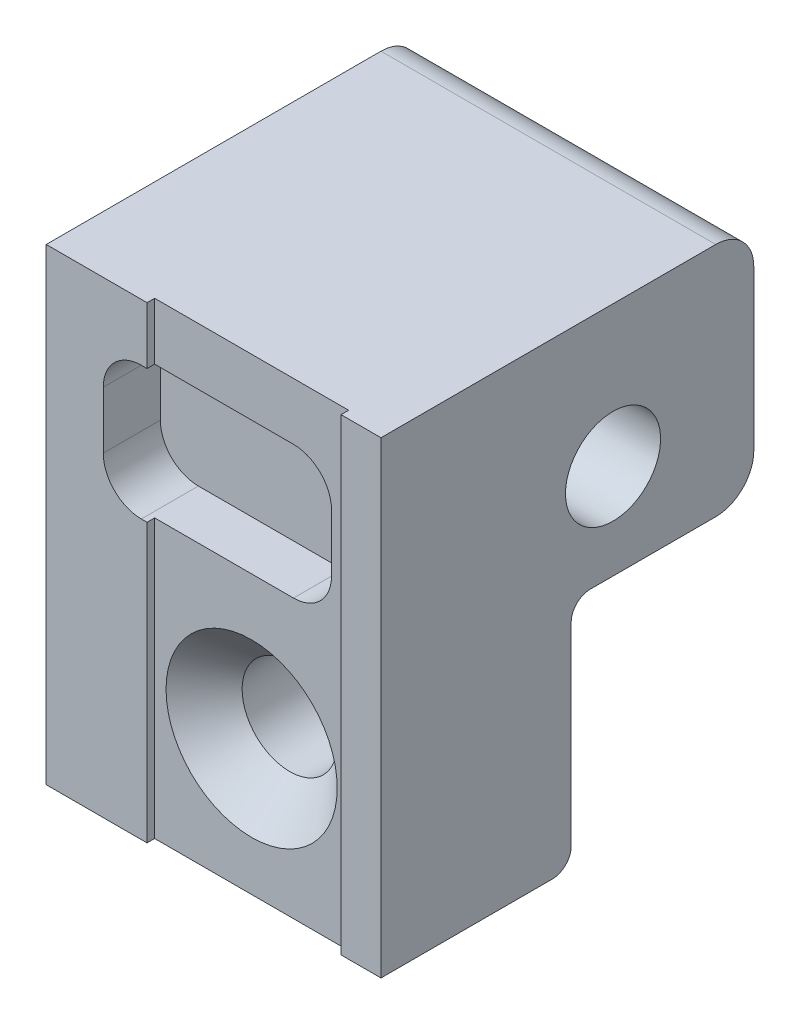
ISO-10303-21;
HEADER;
FILE_DESCRIPTION(('STEP AP214'),'2;1');
FILE_NAME('part.step','',(''),(''),'','','');
FILE_SCHEMA(('AUTOMOTIVE_DESIGN { 1 0 10303 214 1 1 1 1 }'));
ENDSEC;
DATA;
#1=APPLICATION_CONTEXT('core data for automotive mechanical design processes');
#2=APPLICATION_PROTOCOL_DEFINITION('international standard','automotive_design',2000,#1);
#3=PRODUCT_CONTEXT('',#1,'mechanical');
#4=PRODUCT('Part','Part','',(#3));
#5=PRODUCT_RELATED_PRODUCT_CATEGORY('part','',(#4));
#6=PRODUCT_DEFINITION_FORMATION('','',#4);
#7=PRODUCT_DEFINITION_CONTEXT('part definition',#1,'design');
#8=PRODUCT_DEFINITION('design','',#6,#7);
#9=PRODUCT_DEFINITION_SHAPE('','',#8);
#10=(LENGTH_UNIT() NAMED_UNIT(*) SI_UNIT(.MILLI.,.METRE.));
#11=(NAMED_UNIT(*) PLANE_ANGLE_UNIT() SI_UNIT($,.RADIAN.));
#12=(NAMED_UNIT(*) SI_UNIT($,.STERADIAN.) SOLID_ANGLE_UNIT());
#13=UNCERTAINTY_MEASURE_WITH_UNIT(LENGTH_MEASURE(1.E-05),#10,'distance_accuracy_value','');
#14=(GEOMETRIC_REPRESENTATION_CONTEXT(3) GLOBAL_UNCERTAINTY_ASSIGNED_CONTEXT((#13)) GLOBAL_UNIT_ASSIGNED_CONTEXT((#10,
#11,#12)) REPRESENTATION_CONTEXT('',''));
#15=CARTESIAN_POINT('',(0.,0.,0.));
#16=DIRECTION('',(0.,0.,1.));
#17=DIRECTION('',(1.,0.,0.));
#18=AXIS2_PLACEMENT_3D('',#15,#16,#17);
#19=CARTESIAN_POINT('',(1.37999999999991,15.4500000000005,-1.5));
#20=DIRECTION('',(0.,0.,1.));
#21=DIRECTION('',(1.,0.,0.));
#22=AXIS2_PLACEMENT_3D('',#19,#20,#21);
#23=PLANE('',#22);
#24=DIRECTION('',(0.,1.,0.));
#25=VECTOR('',#24,1.);
#26=CARTESIAN_POINT('',(1.37999999999991,15.4500000000005,-1.5));
#27=LINE('',#26,#25);
#28=CARTESIAN_POINT('',(1.37999999999991,17.9500000000005,-1.5));
#29=VERTEX_POINT('',#28);
#30=CARTESIAN_POINT('',(1.37999999999991,16.4500000000005,-1.5));
#31=VERTEX_POINT('',#30);
#32=EDGE_CURVE('E245',#29,#31,#27,.F.);
#33=ORIENTED_EDGE('',*,*,#32,.T.);
#34=CARTESIAN_POINT('',(2.37999999999991,16.4500000000005,-1.5));
#35=DIRECTION('',(0.,0.,1.));
#36=DIRECTION('',(1.,0.,0.));
#37=AXIS2_PLACEMENT_3D('',#34,#35,#36);
#38=CIRCLE('',#37,1.);
#39=CARTESIAN_POINT('',(2.37999999999991,15.4500000000005,-1.5));
#40=VERTEX_POINT('',#39);
#41=EDGE_CURVE('E189',#31,#40,#38,.T.);
#42=ORIENTED_EDGE('',*,*,#41,.T.);
#43=DIRECTION('',(1.,0.,0.));
#44=VECTOR('',#43,1.);
#45=CARTESIAN_POINT('',(1.37999999999991,15.4500000000005,-1.5));
#46=LINE('',#45,#44);
#47=CARTESIAN_POINT('',(6.17999999999991,15.4500000000005,-1.5));
#48=VERTEX_POINT('',#47);
#49=EDGE_CURVE('E187',#40,#48,#46,.T.);
#50=ORIENTED_EDGE('',*,*,#49,.T.);
#51=CARTESIAN_POINT('',(6.17999999999991,16.4500000000005,-1.5));
#52=DIRECTION('',(0.,0.,1.));
#53=DIRECTION('',(1.,0.,0.));
#54=AXIS2_PLACEMENT_3D('',#51,#52,#53);
#55=CIRCLE('',#54,1.);
#56=CARTESIAN_POINT('',(7.17999999999991,16.4500000000005,-1.5));
#57=VERTEX_POINT('',#56);
#58=EDGE_CURVE('E20',#48,#57,#55,.T.);
#59=ORIENTED_EDGE('',*,*,#58,.T.);
#60=DIRECTION('',(0.,1.,0.));
#61=VECTOR('',#60,1.);
#62=CARTESIAN_POINT('',(7.17999999999991,15.4500000000005,-1.5));
#63=LINE('',#62,#61);
#64=CARTESIAN_POINT('',(7.17999999999991,17.9500000000005,-1.5));
#65=VERTEX_POINT('',#64);
#66=EDGE_CURVE('E185',#57,#65,#63,.T.);
#67=ORIENTED_EDGE('',*,*,#66,.T.);
#68=CARTESIAN_POINT('',(6.17999999999991,17.9500000000005,-1.5));
#69=DIRECTION('',(0.,0.,1.));
#70=DIRECTION('',(1.,0.,0.));
#71=AXIS2_PLACEMENT_3D('',#68,#69,#70);
#72=CIRCLE('',#71,1.);
#73=CARTESIAN_POINT('',(6.17999999999991,18.9500000000005,-1.5));
#74=VERTEX_POINT('',#73);
#75=EDGE_CURVE('E230',#65,#74,#72,.T.);
#76=ORIENTED_EDGE('',*,*,#75,.T.);
#77=DIRECTION('',(1.,0.,0.));
#78=VECTOR('',#77,1.);
#79=CARTESIAN_POINT('',(1.37999999999991,18.9500000000005,-1.5));
#80=LINE('',#79,#78);
#81=CARTESIAN_POINT('',(2.37999999999991,18.9500000000005,-1.5));
#82=VERTEX_POINT('',#81);
#83=EDGE_CURVE('E222',#74,#82,#80,.F.);
#84=ORIENTED_EDGE('',*,*,#83,.T.);
#85=CARTESIAN_POINT('',(2.37999999999991,17.9500000000005,-1.5));
#86=DIRECTION('',(0.,0.,1.));
#87=DIRECTION('',(1.,0.,0.));
#88=AXIS2_PLACEMENT_3D('',#85,#86,#87);
#89=CIRCLE('',#88,1.);
#90=EDGE_CURVE('E247',#82,#29,#89,.T.);
#91=ORIENTED_EDGE('',*,*,#90,.T.);
#92=EDGE_LOOP('',(#33,#42,#50,#59,#67,#76,#84,#91));
#93=FACE_BOUND('',#92,.T.);
#94=ADVANCED_FACE('F17',(#93),#23,.T.);
#95=CARTESIAN_POINT('',(6.17999999999991,17.9500000000005,-1.5));
#96=DIRECTION('',(0.,0.,1.));
#97=DIRECTION('',(1.,0.,0.));
#98=AXIS2_PLACEMENT_3D('',#95,#96,#97);
#99=CYLINDRICAL_SURFACE('',#98,1.);
#100=DIRECTION('',(0.,0.,-1.));
#101=VECTOR('',#100,1.);
#102=CARTESIAN_POINT('',(7.17999999999991,17.9500000000005,-1.5));
#103=LINE('',#102,#101);
#104=CARTESIAN_POINT('',(7.17999999999991,17.9500000000005,-0.200000000000402));
#105=VERTEX_POINT('',#104);
#106=EDGE_CURVE('E198',#65,#105,#103,.F.);
#107=ORIENTED_EDGE('',*,*,#106,.T.);
#108=CARTESIAN_POINT('',(6.17999999999991,17.9500000000005,-0.200000000000297));
#109=DIRECTION('',(0.,0.,1.));
#110=DIRECTION('',(1.,0.,0.));
#111=AXIS2_PLACEMENT_3D('',#108,#109,#110);
#112=CIRCLE('',#111,1.);
#113=CARTESIAN_POINT('',(6.17999999999991,18.9500000000005,-0.2000000000003));
#114=VERTEX_POINT('',#113);
#115=EDGE_CURVE('E283',#105,#114,#112,.T.);
#116=ORIENTED_EDGE('',*,*,#115,.T.);
#117=DIRECTION('',(0.,0.,1.));
#118=VECTOR('',#117,1.);
#119=CARTESIAN_POINT('',(6.17999999999991,18.9500000000005,-1.5));
#120=LINE('',#119,#118);
#121=EDGE_CURVE('E219',#114,#74,#120,.F.);
#122=ORIENTED_EDGE('',*,*,#121,.T.);
#123=ORIENTED_EDGE('',*,*,#75,.F.);
#124=EDGE_LOOP('',(#107,#116,#122,#123));
#125=FACE_BOUND('',#124,.T.);
#126=ADVANCED_FACE('F488',(#125),#99,.F.);
#127=CARTESIAN_POINT('',(1.37999999999991,18.9500000000005,-1.5));
#128=DIRECTION('',(0.,1.,0.));
#129=DIRECTION('',(0.,0.,1.));
#130=AXIS2_PLACEMENT_3D('',#127,#128,#129);
#131=PLANE('',#130);
#132=ORIENTED_EDGE('',*,*,#121,.F.);
#133=DIRECTION('',(1.,0.,0.));
#134=VECTOR('',#133,1.);
#135=CARTESIAN_POINT('',(2.5299999999999,18.9500000000005,-0.200000000000304));
#136=LINE('',#135,#134);
#137=CARTESIAN_POINT('',(2.5299999999999,18.9500000000005,-0.200000000000304));
#138=VERTEX_POINT('',#137);
#139=EDGE_CURVE('E285',#114,#138,#136,.F.);
#140=ORIENTED_EDGE('',*,*,#139,.T.);
#141=DIRECTION('',(0.,0.,1.));
#142=VECTOR('',#141,1.);
#143=CARTESIAN_POINT('',(2.5299999999999,18.9500000000005,-2.5058080610485E-12));
#144=LINE('',#143,#142);
#145=CARTESIAN_POINT('',(2.5299999999999,18.9500000000005,0.));
#146=VERTEX_POINT('',#145);
#147=EDGE_CURVE('E212',#138,#146,#144,.T.);
#148=ORIENTED_EDGE('',*,*,#147,.T.);
#149=DIRECTION('',(1.,0.,0.));
#150=VECTOR('',#149,1.);
#151=CARTESIAN_POINT('',(1.37999999999991,18.9500000000005,0.));
#152=LINE('',#151,#150);
#153=CARTESIAN_POINT('',(2.37999999999991,18.9500000000005,0.));
#154=VERTEX_POINT('',#153);
#155=EDGE_CURVE('E223',#154,#146,#152,.T.);
#156=ORIENTED_EDGE('',*,*,#155,.F.);
#157=DIRECTION('',(0.,0.,1.));
#158=VECTOR('',#157,1.);
#159=CARTESIAN_POINT('',(2.37999999999991,18.9500000000005,-1.5));
#160=LINE('',#159,#158);
#161=EDGE_CURVE('E290',#154,#82,#160,.F.);
#162=ORIENTED_EDGE('',*,*,#161,.T.);
#163=ORIENTED_EDGE('',*,*,#83,.F.);
#164=EDGE_LOOP('',(#132,#140,#148,#156,#162,#163));
#165=FACE_BOUND('',#164,.T.);
#166=ADVANCED_FACE('F485',(#165),#131,.F.);
#167=CARTESIAN_POINT('',(1.37999999999991,15.4500000000005,-1.5));
#168=DIRECTION('',(0.,-1.,0.));
#169=DIRECTION('',(0.,0.,-1.));
#170=AXIS2_PLACEMENT_3D('',#167,#168,#169);
#171=PLANE('',#170);
#172=DIRECTION('',(0.,0.,1.));
#173=VECTOR('',#172,1.);
#174=CARTESIAN_POINT('',(6.17999999999991,15.4500000000005,-1.5));
#175=LINE('',#174,#173);
#176=CARTESIAN_POINT('',(6.17999999999991,15.4500000000005,-0.200000000000912));
#177=VERTEX_POINT('',#176);
#178=EDGE_CURVE('E180',#177,#48,#175,.F.);
#179=ORIENTED_EDGE('',*,*,#178,.T.);
#180=ORIENTED_EDGE('',*,*,#49,.F.);
#181=DIRECTION('',(0.,0.,1.));
#182=VECTOR('',#181,1.);
#183=CARTESIAN_POINT('',(2.37999999999991,15.4500000000005,-1.5));
#184=LINE('',#183,#182);
#185=CARTESIAN_POINT('',(2.37999999999991,15.4500000000005,-5.05671893247239E-13));
#186=VERTEX_POINT('',#185);
#187=EDGE_CURVE('E307',#40,#186,#184,.T.);
#188=ORIENTED_EDGE('',*,*,#187,.T.);
#189=DIRECTION('',(1.,0.,0.));
#190=VECTOR('',#189,1.);
#191=CARTESIAN_POINT('',(1.37999999999991,15.4500000000005,-1.01568059518442E-12));
#192=LINE('',#191,#190);
#193=CARTESIAN_POINT('',(2.5299999999999,15.4500000000005,-3.35668992601512E-13));
#194=VERTEX_POINT('',#193);
#195=EDGE_CURVE('E193',#194,#186,#192,.F.);
#196=ORIENTED_EDGE('',*,*,#195,.F.);
#197=DIRECTION('',(0.,0.,1.));
#198=VECTOR('',#197,1.);
#199=CARTESIAN_POINT('',(2.5299999999999,15.4500000000005,-2.5058080610485E-12));
#200=LINE('',#199,#198);
#201=CARTESIAN_POINT('',(2.5299999999999,15.4500000000005,-0.200000000001017));
#202=VERTEX_POINT('',#201);
#203=EDGE_CURVE('E211',#194,#202,#200,.F.);
#204=ORIENTED_EDGE('',*,*,#203,.T.);
#205=DIRECTION('',(1.,0.,0.));
#206=VECTOR('',#205,1.);
#207=CARTESIAN_POINT('',(2.5299999999999,15.4500000000005,-0.200000000001018));
#208=LINE('',#207,#206);
#209=EDGE_CURVE('E197',#202,#177,#208,.T.);
#210=ORIENTED_EDGE('',*,*,#209,.T.);
#211=EDGE_LOOP('',(#179,#180,#188,#196,#204,#210));
#212=FACE_BOUND('',#211,.T.);
#213=ADVANCED_FACE('F195',(#212),#171,.F.);
#214=CARTESIAN_POINT('',(6.17999999999991,16.4500000000005,-1.5));
#215=DIRECTION('',(0.,0.,1.));
#216=DIRECTION('',(1.,0.,0.));
#217=AXIS2_PLACEMENT_3D('',#214,#215,#216);
#218=CYLINDRICAL_SURFACE('',#217,1.);
#219=ORIENTED_EDGE('',*,*,#178,.F.);
#220=CARTESIAN_POINT('',(6.17999999999991,16.4500000000005,-0.200000000000807));
#221=DIRECTION('',(0.,0.,1.));
#222=DIRECTION('',(1.,0.,0.));
#223=AXIS2_PLACEMENT_3D('',#220,#221,#222);
#224=CIRCLE('',#223,1.);
#225=CARTESIAN_POINT('',(7.17999999999991,16.4500000000005,-0.20000000000081));
#226=VERTEX_POINT('',#225);
#227=EDGE_CURVE('E281',#177,#226,#224,.T.);
#228=ORIENTED_EDGE('',*,*,#227,.T.);
#229=DIRECTION('',(0.,0.,-1.));
#230=VECTOR('',#229,1.);
#231=CARTESIAN_POINT('',(7.17999999999991,16.4500000000005,-1.5));
#232=LINE('',#231,#230);
#233=EDGE_CURVE('E183',#226,#57,#232,.T.);
#234=ORIENTED_EDGE('',*,*,#233,.T.);
#235=ORIENTED_EDGE('',*,*,#58,.F.);
#236=EDGE_LOOP('',(#219,#228,#234,#235));
#237=FACE_BOUND('',#236,.T.);
#238=ADVANCED_FACE('F178',(#237),#218,.F.);
#239=CARTESIAN_POINT('',(7.17999999999991,18.9500000000005,-1.5));
#240=DIRECTION('',(1.,0.,0.));
#241=DIRECTION('',(0.,0.,-1.));
#242=AXIS2_PLACEMENT_3D('',#239,#240,#241);
#243=PLANE('',#242);
#244=ORIENTED_EDGE('',*,*,#233,.F.);
#245=DIRECTION('',(0.,1.,2.0391851472707E-13));
#246=VECTOR('',#245,1.);
#247=CARTESIAN_POINT('',(7.17999999999991,8.14999999999855,-0.200000000002507));
#248=LINE('',#247,#246);
#249=EDGE_CURVE('E280',#226,#105,#248,.T.);
#250=ORIENTED_EDGE('',*,*,#249,.T.);
#251=ORIENTED_EDGE('',*,*,#106,.F.);
#252=ORIENTED_EDGE('',*,*,#66,.F.);
#253=EDGE_LOOP('',(#244,#250,#251,#252));
#254=FACE_BOUND('',#253,.T.);
#255=ADVANCED_FACE('F493',(#254),#243,.F.);
#256=CARTESIAN_POINT('',(5.07999999999991,11.7,-0.200000000120326));
#257=DIRECTION('',(0.,0.,1.));
#258=DIRECTION('',(0.,-1.,0.));
#259=AXIS2_PLACEMENT_3D('',#256,#257,#258);
#260=CONICAL_SURFACE('',#259,2.24999999991089,0.785398163369027);
#261=CARTESIAN_POINT('',(5.07999999999991,11.7,-1.20000000000179));
#262=DIRECTION('',(0.,0.,1.));
#263=DIRECTION('',(1.,0.,0.));
#264=AXIS2_PLACEMENT_3D('',#261,#262,#263);
#265=CIRCLE('',#264,1.25000000000009);
#266=CARTESIAN_POINT('',(6.33,11.7,-1.20000000000179));
#267=VERTEX_POINT('',#266);
#268=EDGE_CURVE('E224',#267,#267,#265,.F.);
#269=ORIENTED_EDGE('',*,*,#268,.T.);
#270=EDGE_LOOP('',(#269));
#271=FACE_BOUND('',#270,.T.);
#272=CARTESIAN_POINT('',(5.07999999999991,11.7,-0.200000000063483));
#273=DIRECTION('',(0.,0.,1.));
#274=DIRECTION('',(0.,-1.,0.));
#275=AXIS2_PLACEMENT_3D('',#272,#273,#274);
#276=CIRCLE('',#275,2.24999999996773);
#277=CARTESIAN_POINT('',(5.07999999999991,9.45000000003227,-0.200000000063483));
#278=VERTEX_POINT('',#277);
#279=EDGE_CURVE('E277',#278,#278,#276,.T.);
#280=ORIENTED_EDGE('',*,*,#279,.T.);
#281=EDGE_LOOP('',(#280));
#282=FACE_BOUND('',#281,.T.);
#283=ADVANCED_FACE('F495',(#271,#282),#260,.F.);
#284=CARTESIAN_POINT('',(2.5299999999999,8.1499999999985,-2.5058080610485E-12));
#285=DIRECTION('',(-1.,0.,0.));
#286=DIRECTION('',(0.,0.,1.));
#287=AXIS2_PLACEMENT_3D('',#284,#285,#286);
#288=PLANE('',#287);
#289=DIRECTION('',(0.,0.,1.));
#290=VECTOR('',#289,1.);
#291=CARTESIAN_POINT('',(2.5299999999999,20.4500000000005,-2.5058080610485E-12));
#292=LINE('',#291,#290);
#293=CARTESIAN_POINT('',(2.5299999999999,20.4500000000005,0.));
#294=VERTEX_POINT('',#293);
#295=CARTESIAN_POINT('',(2.5299999999999,20.4500000000005,-0.199999999999997));
#296=VERTEX_POINT('',#295);
#297=EDGE_CURVE('E209',#294,#296,#292,.F.);
#298=ORIENTED_EDGE('',*,*,#297,.F.);
#299=DIRECTION('',(0.,1.,0.));
#300=VECTOR('',#299,1.);
#301=CARTESIAN_POINT('',(2.5299999999999,20.4500000000005,0.));
#302=LINE('',#301,#300);
#303=EDGE_CURVE('E238',#146,#294,#302,.T.);
#304=ORIENTED_EDGE('',*,*,#303,.F.);
#305=ORIENTED_EDGE('',*,*,#147,.F.);
#306=DIRECTION('',(0.,1.,2.0391851472707E-13));
#307=VECTOR('',#306,1.);
#308=CARTESIAN_POINT('',(2.5299999999999,8.14999999999855,-0.200000000002507));
#309=LINE('',#308,#307);
#310=EDGE_CURVE('E206',#138,#296,#309,.T.);
#311=ORIENTED_EDGE('',*,*,#310,.T.);
#312=EDGE_LOOP('',(#298,#304,#305,#311));
#313=FACE_BOUND('',#312,.T.);
#314=ADVANCED_FACE('F480',(#313),#288,.F.);
#315=CARTESIAN_POINT('',(2.5299999999999,8.1499999999985,-2.5058080610485E-12));
#316=DIRECTION('',(-1.,0.,0.));
#317=DIRECTION('',(0.,0.,1.));
#318=AXIS2_PLACEMENT_3D('',#315,#316,#317);
#319=PLANE('',#318);
#320=DIRECTION('',(0.,0.,1.));
#321=VECTOR('',#320,1.);
#322=CARTESIAN_POINT('',(2.5299999999999,8.14999999999855,-2.5058080610485E-12));
#323=LINE('',#322,#321);
#324=CARTESIAN_POINT('',(2.5299999999999,8.14999999999953,-0.20000000000201));
#325=VERTEX_POINT('',#324);
#326=CARTESIAN_POINT('',(2.5299999999999,8.14999999999985,-1.66909310446902E-12));
#327=VERTEX_POINT('',#326);
#328=EDGE_CURVE('E314',#325,#327,#323,.T.);
#329=ORIENTED_EDGE('',*,*,#328,.F.);
#330=DIRECTION('',(0.,1.,2.0391851472707E-13));
#331=VECTOR('',#330,1.);
#332=CARTESIAN_POINT('',(2.5299999999999,8.14999999999855,-0.200000000002507));
#333=LINE('',#332,#331);
#334=EDGE_CURVE('E203',#325,#202,#333,.T.);
#335=ORIENTED_EDGE('',*,*,#334,.T.);
#336=ORIENTED_EDGE('',*,*,#203,.F.);
#337=DIRECTION('',(0.,1.,0.));
#338=VECTOR('',#337,1.);
#339=CARTESIAN_POINT('',(2.5299999999999,20.4500000000005,0.));
#340=LINE('',#339,#338);
#341=EDGE_CURVE('E241',#327,#194,#340,.T.);
#342=ORIENTED_EDGE('',*,*,#341,.F.);
#343=EDGE_LOOP('',(#329,#335,#336,#342));
#344=FACE_BOUND('',#343,.T.);
#345=ADVANCED_FACE('F325',(#344),#319,.F.);
#346=CARTESIAN_POINT('',(2.37999999999991,16.4500000000005,-1.5));
#347=DIRECTION('',(0.,0.,1.));
#348=DIRECTION('',(1.,0.,0.));
#349=AXIS2_PLACEMENT_3D('',#346,#347,#348);
#350=CYLINDRICAL_SURFACE('',#349,1.);
#351=DIRECTION('',(0.,0.,1.));
#352=VECTOR('',#351,1.);
#353=CARTESIAN_POINT('',(1.37999999999991,16.4500000000005,-1.5));
#354=LINE('',#353,#352);
#355=CARTESIAN_POINT('',(1.37999999999991,16.4500000000005,0.));
#356=VERTEX_POINT('',#355);
#357=EDGE_CURVE('E304',#31,#356,#354,.T.);
#358=ORIENTED_EDGE('',*,*,#357,.T.);
#359=CARTESIAN_POINT('',(2.37999999999991,16.4500000000005,0.));
#360=DIRECTION('',(0.,0.,1.));
#361=DIRECTION('',(1.,0.,0.));
#362=AXIS2_PLACEMENT_3D('',#359,#360,#361);
#363=CIRCLE('',#362,1.);
#364=EDGE_CURVE('E273',#186,#356,#363,.F.);
#365=ORIENTED_EDGE('',*,*,#364,.F.);
#366=ORIENTED_EDGE('',*,*,#187,.F.);
#367=ORIENTED_EDGE('',*,*,#41,.F.);
#368=EDGE_LOOP('',(#358,#365,#366,#367));
#369=FACE_BOUND('',#368,.T.);
#370=ADVANCED_FACE('F568',(#369),#350,.F.);
#371=CARTESIAN_POINT('',(1.37999999999991,18.9500000000005,-1.5));
#372=DIRECTION('',(-1.,0.,0.));
#373=DIRECTION('',(0.,0.,1.));
#374=AXIS2_PLACEMENT_3D('',#371,#372,#373);
#375=PLANE('',#374);
#376=DIRECTION('',(0.,0.,1.));
#377=VECTOR('',#376,1.);
#378=CARTESIAN_POINT('',(1.37999999999991,17.9500000000005,-1.5));
#379=LINE('',#378,#377);
#380=CARTESIAN_POINT('',(1.37999999999991,17.9500000000005,0.));
#381=VERTEX_POINT('',#380);
#382=EDGE_CURVE('E300',#29,#381,#379,.T.);
#383=ORIENTED_EDGE('',*,*,#382,.T.);
#384=DIRECTION('',(0.,1.,0.));
#385=VECTOR('',#384,1.);
#386=CARTESIAN_POINT('',(1.37999999999991,20.4500000000005,0.));
#387=LINE('',#386,#385);
#388=EDGE_CURVE('E272',#356,#381,#387,.T.);
#389=ORIENTED_EDGE('',*,*,#388,.F.);
#390=ORIENTED_EDGE('',*,*,#357,.F.);
#391=ORIENTED_EDGE('',*,*,#32,.F.);
#392=EDGE_LOOP('',(#383,#389,#390,#391));
#393=FACE_BOUND('',#392,.T.);
#394=ADVANCED_FACE('F565',(#393),#375,.F.);
#395=CARTESIAN_POINT('',(2.37999999999991,17.9500000000005,-1.5));
#396=DIRECTION('',(0.,0.,1.));
#397=DIRECTION('',(1.,0.,0.));
#398=AXIS2_PLACEMENT_3D('',#395,#396,#397);
#399=CYLINDRICAL_SURFACE('',#398,1.);
#400=ORIENTED_EDGE('',*,*,#161,.F.);
#401=CARTESIAN_POINT('',(2.37999999999991,17.9500000000005,0.));
#402=DIRECTION('',(0.,0.,1.));
#403=DIRECTION('',(1.,0.,0.));
#404=AXIS2_PLACEMENT_3D('',#401,#402,#403);
#405=CIRCLE('',#404,1.);
#406=EDGE_CURVE('E269',#381,#154,#405,.F.);
#407=ORIENTED_EDGE('',*,*,#406,.F.);
#408=ORIENTED_EDGE('',*,*,#382,.F.);
#409=ORIENTED_EDGE('',*,*,#90,.F.);
#410=EDGE_LOOP('',(#400,#407,#408,#409));
#411=FACE_BOUND('',#410,.T.);
#412=ADVANCED_FACE('F298',(#411),#399,.F.);
#413=CARTESIAN_POINT('',(-0.12000000000009,8.6500000000005,-4.4999998882413));
#414=DIRECTION('',(-1.,0.,0.));
#415=DIRECTION('',(0.,0.,1.));
#416=AXIS2_PLACEMENT_3D('',#413,#414,#415);
#417=CYLINDRICAL_SURFACE('',#416,0.5);
#418=CARTESIAN_POINT('',(8.68,8.6500000000005,-4.4999998882413));
#419=DIRECTION('',(-1.,0.,0.));
#420=DIRECTION('',(0.,0.,1.));
#421=AXIS2_PLACEMENT_3D('',#418,#419,#420);
#422=CIRCLE('',#421,0.5);
#423=CARTESIAN_POINT('',(8.68,8.6500000000005,-4.9999998882413));
#424=VERTEX_POINT('',#423);
#425=CARTESIAN_POINT('',(8.68,8.1500000000005,-4.4999998882413));
#426=VERTEX_POINT('',#425);
#427=EDGE_CURVE('E228',#424,#426,#422,.T.);
#428=ORIENTED_EDGE('',*,*,#427,.T.);
#429=DIRECTION('',(1.,0.,0.));
#430=VECTOR('',#429,1.);
#431=CARTESIAN_POINT('',(-0.12000000000009,8.1500000000005,-4.4999998882413));
#432=LINE('',#431,#430);
#433=CARTESIAN_POINT('',(-0.12000000000009,8.1500000000005,-4.4999998882413));
#434=VERTEX_POINT('',#433);
#435=EDGE_CURVE('E365',#434,#426,#432,.T.);
#436=ORIENTED_EDGE('',*,*,#435,.F.);
#437=CARTESIAN_POINT('',(-0.12000000000009,8.6500000000005,-4.4999998882413));
#438=DIRECTION('',(-1.,0.,0.));
#439=DIRECTION('',(0.,0.,1.));
#440=AXIS2_PLACEMENT_3D('',#437,#438,#439);
#441=CIRCLE('',#440,0.5);
#442=CARTESIAN_POINT('',(-0.12000000000009,8.6500000000005,-4.9999998882413));
#443=VERTEX_POINT('',#442);
#444=EDGE_CURVE('E266',#443,#434,#441,.T.);
#445=ORIENTED_EDGE('',*,*,#444,.F.);
#446=DIRECTION('',(-1.,0.,0.));
#447=VECTOR('',#446,1.);
#448=CARTESIAN_POINT('',(-0.12000000000009,8.6500000000005,-4.9999998882413));
#449=LINE('',#448,#447);
#450=EDGE_CURVE('E356',#424,#443,#449,.T.);
#451=ORIENTED_EDGE('',*,*,#450,.F.);
#452=EDGE_LOOP('',(#428,#436,#445,#451));
#453=FACE_BOUND('',#452,.T.);
#454=ADVANCED_FACE('F558',(#453),#417,.T.);
#455=CARTESIAN_POINT('',(5.07999999999991,11.7,0.));
#456=DIRECTION('',(0.,0.,1.));
#457=DIRECTION('',(1.,0.,0.));
#458=AXIS2_PLACEMENT_3D('',#455,#456,#457);
#459=CYLINDRICAL_SURFACE('',#458,1.25000000000009);
#460=CARTESIAN_POINT('',(5.07999999999991,11.7,-4.9999998882413));
#461=DIRECTION('',(0.,0.,1.));
#462=DIRECTION('',(1.,0.,0.));
#463=AXIS2_PLACEMENT_3D('',#460,#461,#462);
#464=CIRCLE('',#463,1.25000000000009);
#465=CARTESIAN_POINT('',(6.33,11.7,-4.9999998882413));
#466=VERTEX_POINT('',#465);
#467=EDGE_CURVE('E253',#466,#466,#464,.T.);
#468=ORIENTED_EDGE('',*,*,#467,.F.);
#469=EDGE_LOOP('',(#468));
#470=FACE_BOUND('',#469,.T.);
#471=ORIENTED_EDGE('',*,*,#268,.F.);
#472=EDGE_LOOP('',(#471));
#473=FACE_BOUND('',#472,.T.);
#474=ADVANCED_FACE('F554',(#470,#473),#459,.F.);
#475=CARTESIAN_POINT('',(-0.12000000000009,13.7500000000025,-5.4999998882413));
#476=DIRECTION('',(-1.,0.,0.));
#477=DIRECTION('',(0.,0.,1.));
#478=AXIS2_PLACEMENT_3D('',#475,#476,#477);
#479=CYLINDRICAL_SURFACE('',#478,0.5);
#480=DIRECTION('',(-1.,0.,0.));
#481=VECTOR('',#480,1.);
#482=CARTESIAN_POINT('',(-0.12000000000009,13.7500000000025,-4.9999998882413));
#483=LINE('',#482,#481);
#484=CARTESIAN_POINT('',(-0.12000000000009,13.7500000000025,-4.9999998882413));
#485=VERTEX_POINT('',#484);
#486=CARTESIAN_POINT('',(8.68,13.7500000000025,-4.9999998882413));
#487=VERTEX_POINT('',#486);
#488=EDGE_CURVE('E257',#485,#487,#483,.F.);
#489=ORIENTED_EDGE('',*,*,#488,.F.);
#490=CARTESIAN_POINT('',(-0.12000000000009,13.7500000000025,-5.4999998882413));
#491=DIRECTION('',(-1.,0.,0.));
#492=DIRECTION('',(0.,0.,1.));
#493=AXIS2_PLACEMENT_3D('',#490,#491,#492);
#494=CIRCLE('',#493,0.5);
#495=CARTESIAN_POINT('',(-0.12000000000009,14.2500000000025,-5.4999998882413));
#496=VERTEX_POINT('',#495);
#497=EDGE_CURVE('E258',#496,#485,#494,.F.);
#498=ORIENTED_EDGE('',*,*,#497,.F.);
#499=DIRECTION('',(1.,0.,0.));
#500=VECTOR('',#499,1.);
#501=CARTESIAN_POINT('',(-0.12000000000009,14.2500000000025,-5.4999998882413));
#502=LINE('',#501,#500);
#503=CARTESIAN_POINT('',(8.68,14.2500000000025,-5.4999998882413));
#504=VERTEX_POINT('',#503);
#505=EDGE_CURVE('E256',#504,#496,#502,.F.);
#506=ORIENTED_EDGE('',*,*,#505,.F.);
#507=CARTESIAN_POINT('',(8.68,13.7500000000025,-5.4999998882413));
#508=DIRECTION('',(-1.,0.,0.));
#509=DIRECTION('',(0.,0.,1.));
#510=AXIS2_PLACEMENT_3D('',#507,#508,#509);
#511=CIRCLE('',#510,0.5);
#512=EDGE_CURVE('E227',#487,#504,#511,.T.);
#513=ORIENTED_EDGE('',*,*,#512,.F.);
#514=EDGE_LOOP('',(#489,#498,#506,#513));
#515=FACE_BOUND('',#514,.T.);
#516=ADVANCED_FACE('F550',(#515),#479,.F.);
#517=CARTESIAN_POINT('',(-0.12000000000009,15.2500000000025,-8.8));
#518=DIRECTION('',(-1.,0.,0.));
#519=DIRECTION('',(0.,0.,1.));
#520=AXIS2_PLACEMENT_3D('',#517,#518,#519);
#521=CYLINDRICAL_SURFACE('',#520,0.999999999999999);
#522=CARTESIAN_POINT('',(8.68,15.2500000000025,-8.8));
#523=DIRECTION('',(-1.,0.,0.));
#524=DIRECTION('',(0.,0.,1.));
#525=AXIS2_PLACEMENT_3D('',#522,#523,#524);
#526=CIRCLE('',#525,0.999999999999999);
#527=CARTESIAN_POINT('',(8.68,15.2500000000025,-9.8));
#528=VERTEX_POINT('',#527);
#529=CARTESIAN_POINT('',(8.68,14.2500000000025,-8.8));
#530=VERTEX_POINT('',#529);
#531=EDGE_CURVE('E286',#528,#530,#526,.T.);
#532=ORIENTED_EDGE('',*,*,#531,.T.);
#533=DIRECTION('',(1.,0.,0.));
#534=VECTOR('',#533,1.);
#535=CARTESIAN_POINT('',(-0.12000000000009,14.2500000000025,-8.8));
#536=LINE('',#535,#534);
#537=CARTESIAN_POINT('',(-0.12000000000009,14.2500000000025,-8.8));
#538=VERTEX_POINT('',#537);
#539=EDGE_CURVE('E352',#538,#530,#536,.T.);
#540=ORIENTED_EDGE('',*,*,#539,.F.);
#541=CARTESIAN_POINT('',(-0.12000000000009,15.2500000000025,-8.8));
#542=DIRECTION('',(-1.,0.,0.));
#543=DIRECTION('',(0.,0.,1.));
#544=AXIS2_PLACEMENT_3D('',#541,#542,#543);
#545=CIRCLE('',#544,0.999999999999999);
#546=CARTESIAN_POINT('',(-0.12000000000009,15.2500000000025,-9.79999999999999));
#547=VERTEX_POINT('',#546);
#548=EDGE_CURVE('E261',#547,#538,#545,.T.);
#549=ORIENTED_EDGE('',*,*,#548,.F.);
#550=DIRECTION('',(1.,0.,0.));
#551=VECTOR('',#550,1.);
#552=CARTESIAN_POINT('',(-0.12000000000009,15.2500000000025,-9.79999999999999));
#553=LINE('',#552,#551);
#554=EDGE_CURVE('E348',#528,#547,#553,.F.);
#555=ORIENTED_EDGE('',*,*,#554,.F.);
#556=EDGE_LOOP('',(#532,#540,#549,#555));
#557=FACE_BOUND('',#556,.T.);
#558=ADVANCED_FACE('F546',(#557),#521,.T.);
#559=CARTESIAN_POINT('',(2.5299999999999,8.14999999999855,-0.200000000002507));
#560=DIRECTION('',(0.,2.0391851472707E-13,-1.));
#561=DIRECTION('',(0.,1.,2.0391851472707E-13));
#562=AXIS2_PLACEMENT_3D('',#559,#560,#561);
#563=PLANE('',#562);
#564=ORIENTED_EDGE('',*,*,#279,.F.);
#565=EDGE_LOOP('',(#564));
#566=FACE_BOUND('',#565,.T.);
#567=ORIENTED_EDGE('',*,*,#227,.F.);
#568=ORIENTED_EDGE('',*,*,#209,.F.);
#569=ORIENTED_EDGE('',*,*,#334,.F.);
#570=DIRECTION('',(1.,0.,0.));
#571=VECTOR('',#570,1.);
#572=CARTESIAN_POINT('',(-0.12000000000009,8.1500000000005,-0.200000000002507));
#573=LINE('',#572,#571);
#574=CARTESIAN_POINT('',(7.62999999999991,8.14999999999983,-0.200000000002507));
#575=VERTEX_POINT('',#574);
#576=EDGE_CURVE('E357',#575,#325,#573,.F.);
#577=ORIENTED_EDGE('',*,*,#576,.F.);
#578=DIRECTION('',(0.,1.,0.));
#579=VECTOR('',#578,1.);
#580=CARTESIAN_POINT('',(7.62999999999991,8.1499999999985,-0.200000000002507));
#581=LINE('',#580,#579);
#582=CARTESIAN_POINT('',(7.62999999999991,20.4500000000005,-0.200000000000832));
#583=VERTEX_POINT('',#582);
#584=EDGE_CURVE('E268',#575,#583,#581,.T.);
#585=ORIENTED_EDGE('',*,*,#584,.T.);
#586=DIRECTION('',(1.,0.,0.));
#587=VECTOR('',#586,1.);
#588=CARTESIAN_POINT('',(-0.12000000000009,20.4500000000005,-0.199999999999995));
#589=LINE('',#588,#587);
#590=EDGE_CURVE('E385',#296,#583,#589,.T.);
#591=ORIENTED_EDGE('',*,*,#590,.F.);
#592=ORIENTED_EDGE('',*,*,#310,.F.);
#593=ORIENTED_EDGE('',*,*,#139,.F.);
#594=ORIENTED_EDGE('',*,*,#115,.F.);
#595=ORIENTED_EDGE('',*,*,#249,.F.);
#596=EDGE_LOOP('',(#567,#568,#569,#577,#585,#591,#592,#593,#594,#595));
#597=FACE_BOUND('',#596,.T.);
#598=ADVANCED_FACE('F329',(#566,#597),#563,.F.);
#599=CARTESIAN_POINT('',(-0.12000000000009,19.4500000000023,-8.8));
#600=DIRECTION('',(-1.,0.,0.));
#601=DIRECTION('',(0.,0.,1.));
#602=AXIS2_PLACEMENT_3D('',#599,#600,#601);
#603=CYLINDRICAL_SURFACE('',#602,0.999999999999999);
#604=CARTESIAN_POINT('',(8.68,19.4500000000023,-8.8));
#605=DIRECTION('',(-1.,0.,0.));
#606=DIRECTION('',(0.,0.,1.));
#607=AXIS2_PLACEMENT_3D('',#604,#605,#606);
#608=CIRCLE('',#607,0.999999999999999);
#609=CARTESIAN_POINT('',(8.68,20.4500000000023,-8.79999999999989));
#610=VERTEX_POINT('',#609);
#611=CARTESIAN_POINT('',(8.68,19.4500000000023,-9.79999999999999));
#612=VERTEX_POINT('',#611);
#613=EDGE_CURVE('E242',#610,#612,#608,.T.);
#614=ORIENTED_EDGE('',*,*,#613,.T.);
#615=DIRECTION('',(1.,0.,0.));
#616=VECTOR('',#615,1.);
#617=CARTESIAN_POINT('',(-0.12000000000009,19.4500000000023,-9.79999999999998));
#618=LINE('',#617,#616);
#619=CARTESIAN_POINT('',(-0.12000000000009,19.4500000000023,-9.79999999999998));
#620=VERTEX_POINT('',#619);
#621=EDGE_CURVE('E347',#620,#612,#618,.T.);
#622=ORIENTED_EDGE('',*,*,#621,.F.);
#623=CARTESIAN_POINT('',(-0.12000000000009,19.4500000000023,-8.8));
#624=DIRECTION('',(-1.,0.,0.));
#625=DIRECTION('',(0.,0.,1.));
#626=AXIS2_PLACEMENT_3D('',#623,#624,#625);
#627=CIRCLE('',#626,0.999999999999999);
#628=CARTESIAN_POINT('',(-0.12000000000009,20.4500000000023,-8.79999999999979));
#629=VERTEX_POINT('',#628);
#630=EDGE_CURVE('E263',#629,#620,#627,.T.);
#631=ORIENTED_EDGE('',*,*,#630,.F.);
#632=DIRECTION('',(1.,0.,0.));
#633=VECTOR('',#632,1.);
#634=CARTESIAN_POINT('',(-0.12000000000009,20.4500000000023,-8.79999999999978));
#635=LINE('',#634,#633);
#636=EDGE_CURVE('E392',#610,#629,#635,.F.);
#637=ORIENTED_EDGE('',*,*,#636,.F.);
#638=EDGE_LOOP('',(#614,#622,#631,#637));
#639=FACE_BOUND('',#638,.T.);
#640=ADVANCED_FACE('F471',(#639),#603,.T.);
#641=CARTESIAN_POINT('',(-0.12000000000009,20.4500000000005,0.));
#642=DIRECTION('',(0.,0.,1.));
#643=DIRECTION('',(1.,0.,0.));
#644=AXIS2_PLACEMENT_3D('',#641,#642,#643);
#645=PLANE('',#644);
#646=ORIENTED_EDGE('',*,*,#406,.T.);
#647=ORIENTED_EDGE('',*,*,#155,.T.);
#648=ORIENTED_EDGE('',*,*,#303,.T.);
#649=DIRECTION('',(1.,0.,0.));
#650=VECTOR('',#649,1.);
#651=CARTESIAN_POINT('',(-0.12000000000009,20.4500000000005,0.));
#652=LINE('',#651,#650);
#653=CARTESIAN_POINT('',(-0.12000000000009,20.4500000000005,0.));
#654=VERTEX_POINT('',#653);
#655=EDGE_CURVE('E406',#654,#294,#652,.T.);
#656=ORIENTED_EDGE('',*,*,#655,.F.);
#657=DIRECTION('',(0.,1.,0.));
#658=VECTOR('',#657,1.);
#659=CARTESIAN_POINT('',(-0.12000000000009,21.0650000000025,0.));
#660=LINE('',#659,#658);
#661=CARTESIAN_POINT('',(-0.12000000000009,8.1500000000005,-1.66909310446902E-12));
#662=VERTEX_POINT('',#661);
#663=EDGE_CURVE('E265',#662,#654,#660,.T.);
#664=ORIENTED_EDGE('',*,*,#663,.F.);
#665=DIRECTION('',(1.,0.,0.));
#666=VECTOR('',#665,1.);
#667=CARTESIAN_POINT('',(-0.12000000000009,8.1500000000005,-2.5058080610485E-12));
#668=LINE('',#667,#666);
#669=EDGE_CURVE('E260',#327,#662,#668,.F.);
#670=ORIENTED_EDGE('',*,*,#669,.F.);
#671=ORIENTED_EDGE('',*,*,#341,.T.);
#672=ORIENTED_EDGE('',*,*,#195,.T.);
#673=ORIENTED_EDGE('',*,*,#364,.T.);
#674=ORIENTED_EDGE('',*,*,#388,.T.);
#675=EDGE_LOOP('',(#646,#647,#648,#656,#664,#670,#671,#672,#673,#674));
#676=FACE_BOUND('',#675,.T.);
#677=ADVANCED_FACE('F373',(#676),#645,.T.);
#678=CARTESIAN_POINT('',(7.62999999999991,8.1499999999985,-2.5058080610485E-12));
#679=DIRECTION('',(1.,0.,0.));
#680=DIRECTION('',(0.,0.,-1.));
#681=AXIS2_PLACEMENT_3D('',#678,#679,#680);
#682=PLANE('',#681);
#683=ORIENTED_EDGE('',*,*,#584,.F.);
#684=DIRECTION('',(0.,0.,-1.));
#685=VECTOR('',#684,1.);
#686=CARTESIAN_POINT('',(7.62999999999991,8.1500000000005,0.));
#687=LINE('',#686,#685);
#688=CARTESIAN_POINT('',(7.62999999999991,8.14999999999917,0.));
#689=VERTEX_POINT('',#688);
#690=EDGE_CURVE('E359',#689,#575,#687,.T.);
#691=ORIENTED_EDGE('',*,*,#690,.F.);
#692=DIRECTION('',(0.,1.,0.));
#693=VECTOR('',#692,1.);
#694=CARTESIAN_POINT('',(7.62999999999991,20.4500000000005,0.));
#695=LINE('',#694,#693);
#696=CARTESIAN_POINT('',(7.62999999999991,20.4500000000005,0.));
#697=VERTEX_POINT('',#696);
#698=EDGE_CURVE('E391',#697,#689,#695,.F.);
#699=ORIENTED_EDGE('',*,*,#698,.F.);
#700=DIRECTION('',(0.,-2.0391851472707E-13,1.));
#701=VECTOR('',#700,1.);
#702=CARTESIAN_POINT('',(7.62999999999991,20.4500000000025,-9.8));
#703=LINE('',#702,#701);
#704=EDGE_CURVE('E388',#583,#697,#703,.T.);
#705=ORIENTED_EDGE('',*,*,#704,.F.);
#706=EDGE_LOOP('',(#683,#691,#699,#705));
#707=FACE_BOUND('',#706,.T.);
#708=ADVANCED_FACE('F389',(#707),#682,.F.);
#709=CARTESIAN_POINT('',(-0.12000000000009,21.0650000000025,0.49));
#710=DIRECTION('',(-1.,0.,0.));
#711=DIRECTION('',(0.,0.,1.));
#712=AXIS2_PLACEMENT_3D('',#709,#710,#711);
#713=PLANE('',#712);
#714=CARTESIAN_POINT('',(-0.12000000000009,16.7500000000015,-6.1));
#715=DIRECTION('',(-1.,0.,0.));
#716=DIRECTION('',(0.,0.,1.));
#717=AXIS2_PLACEMENT_3D('',#714,#715,#716);
#718=CIRCLE('',#717,1.25000000000018);
#719=CARTESIAN_POINT('',(-0.12000000000009,16.7500000000015,-4.84999999999982));
#720=VERTEX_POINT('',#719);
#721=EDGE_CURVE('E249',#720,#720,#718,.F.);
#722=ORIENTED_EDGE('',*,*,#721,.T.);
#723=EDGE_LOOP('',(#722));
#724=FACE_BOUND('',#723,.T.);
#725=DIRECTION('',(0.,0.,-1.));
#726=VECTOR('',#725,1.);
#727=CARTESIAN_POINT('',(-0.12000000000009,14.2500000000025,-4.9999998882413));
#728=LINE('',#727,#726);
#729=EDGE_CURVE('E349',#496,#538,#728,.T.);
#730=ORIENTED_EDGE('',*,*,#729,.F.);
#731=ORIENTED_EDGE('',*,*,#497,.T.);
#732=DIRECTION('',(0.,1.,0.));
#733=VECTOR('',#732,1.);
#734=CARTESIAN_POINT('',(-0.12000000000009,8.1500000000005,-4.9999998882413));
#735=LINE('',#734,#733);
#736=EDGE_CURVE('E353',#443,#485,#735,.T.);
#737=ORIENTED_EDGE('',*,*,#736,.F.);
#738=ORIENTED_EDGE('',*,*,#444,.T.);
#739=DIRECTION('',(0.,0.,-1.));
#740=VECTOR('',#739,1.);
#741=CARTESIAN_POINT('',(-0.12000000000009,8.1500000000005,0.));
#742=LINE('',#741,#740);
#743=EDGE_CURVE('E362',#662,#434,#742,.T.);
#744=ORIENTED_EDGE('',*,*,#743,.F.);
#745=ORIENTED_EDGE('',*,*,#663,.T.);
#746=DIRECTION('',(0.,-2.0391851472707E-13,1.));
#747=VECTOR('',#746,1.);
#748=CARTESIAN_POINT('',(-0.12000000000009,20.4500000000025,-9.8));
#749=LINE('',#748,#747);
#750=EDGE_CURVE('E408',#629,#654,#749,.T.);
#751=ORIENTED_EDGE('',*,*,#750,.F.);
#752=ORIENTED_EDGE('',*,*,#630,.T.);
#753=DIRECTION('',(0.,1.,0.));
#754=VECTOR('',#753,1.);
#755=CARTESIAN_POINT('',(-0.12000000000009,14.2500000000025,-9.8));
#756=LINE('',#755,#754);
#757=EDGE_CURVE('E344',#547,#620,#756,.T.);
#758=ORIENTED_EDGE('',*,*,#757,.F.);
#759=ORIENTED_EDGE('',*,*,#548,.T.);
#760=EDGE_LOOP('',(#730,#731,#737,#738,#744,#745,#751,#752,#758,#759));
#761=FACE_BOUND('',#760,.T.);
#762=ADVANCED_FACE('F476',(#724,#761),#713,.T.);
#763=CARTESIAN_POINT('',(-0.12000000000009,8.1500000000005,0.));
#764=DIRECTION('',(0.,-1.,0.));
#765=DIRECTION('',(0.,0.,-1.));
#766=AXIS2_PLACEMENT_3D('',#763,#764,#765);
#767=PLANE('',#766);
#768=ORIENTED_EDGE('',*,*,#690,.T.);
#769=ORIENTED_EDGE('',*,*,#576,.T.);
#770=ORIENTED_EDGE('',*,*,#328,.T.);
#771=ORIENTED_EDGE('',*,*,#669,.T.);
#772=ORIENTED_EDGE('',*,*,#743,.T.);
#773=ORIENTED_EDGE('',*,*,#435,.T.);
#774=DIRECTION('',(0.,0.,-1.));
#775=VECTOR('',#774,1.);
#776=CARTESIAN_POINT('',(8.68,8.1500000000005,0.49));
#777=LINE('',#776,#775);
#778=CARTESIAN_POINT('',(8.68,8.1499999999995,0.));
#779=VERTEX_POINT('',#778);
#780=EDGE_CURVE('E252',#779,#426,#777,.T.);
#781=ORIENTED_EDGE('',*,*,#780,.F.);
#782=DIRECTION('',(1.,0.,0.));
#783=VECTOR('',#782,1.);
#784=CARTESIAN_POINT('',(-0.12000000000009,8.1499999999985,0.));
#785=LINE('',#784,#783);
#786=EDGE_CURVE('E422',#689,#779,#785,.T.);
#787=ORIENTED_EDGE('',*,*,#786,.F.);
#788=EDGE_LOOP('',(#768,#769,#770,#771,#772,#773,#781,#787));
#789=FACE_BOUND('',#788,.T.);
#790=ADVANCED_FACE('F378',(#789),#767,.T.);
#791=CARTESIAN_POINT('',(-0.12000000000009,8.1500000000005,-4.9999998882413));
#792=DIRECTION('',(0.,0.,-1.));
#793=DIRECTION('',(-1.,0.,0.));
#794=AXIS2_PLACEMENT_3D('',#791,#792,#793);
#795=PLANE('',#794);
#796=ORIENTED_EDGE('',*,*,#467,.T.);
#797=EDGE_LOOP('',(#796));
#798=FACE_BOUND('',#797,.T.);
#799=ORIENTED_EDGE('',*,*,#736,.T.);
#800=ORIENTED_EDGE('',*,*,#488,.T.);
#801=DIRECTION('',(0.,1.,0.));
#802=VECTOR('',#801,1.);
#803=CARTESIAN_POINT('',(8.68,7.5350000000005,-4.9999998882413));
#804=LINE('',#803,#802);
#805=EDGE_CURVE('E454',#424,#487,#804,.T.);
#806=ORIENTED_EDGE('',*,*,#805,.F.);
#807=ORIENTED_EDGE('',*,*,#450,.T.);
#808=EDGE_LOOP('',(#799,#800,#806,#807));
#809=FACE_BOUND('',#808,.T.);
#810=ADVANCED_FACE('F528',(#798,#809),#795,.T.);
#811=CARTESIAN_POINT('',(-0.12000000000009,14.2500000000025,-4.9999998882413));
#812=DIRECTION('',(0.,-1.,0.));
#813=DIRECTION('',(0.,0.,-1.));
#814=AXIS2_PLACEMENT_3D('',#811,#812,#813);
#815=PLANE('',#814);
#816=ORIENTED_EDGE('',*,*,#729,.T.);
#817=ORIENTED_EDGE('',*,*,#539,.T.);
#818=DIRECTION('',(0.,0.,-1.));
#819=VECTOR('',#818,1.);
#820=CARTESIAN_POINT('',(8.68,14.2500000000025,0.49));
#821=LINE('',#820,#819);
#822=EDGE_CURVE('E457',#504,#530,#821,.T.);
#823=ORIENTED_EDGE('',*,*,#822,.F.);
#824=ORIENTED_EDGE('',*,*,#505,.T.);
#825=EDGE_LOOP('',(#816,#817,#823,#824));
#826=FACE_BOUND('',#825,.T.);
#827=ADVANCED_FACE('F524',(#826),#815,.T.);
#828=CARTESIAN_POINT('',(-0.12000000000009,14.2500000000025,-9.8));
#829=DIRECTION('',(0.,0.,-1.));
#830=DIRECTION('',(0.,1.,0.));
#831=AXIS2_PLACEMENT_3D('',#828,#829,#830);
#832=PLANE('',#831);
#833=ORIENTED_EDGE('',*,*,#757,.T.);
#834=ORIENTED_EDGE('',*,*,#621,.T.);
#835=DIRECTION('',(0.,1.,0.));
#836=VECTOR('',#835,1.);
#837=CARTESIAN_POINT('',(8.68,7.5350000000005,-9.8));
#838=LINE('',#837,#836);
#839=EDGE_CURVE('E460',#528,#612,#838,.T.);
#840=ORIENTED_EDGE('',*,*,#839,.F.);
#841=ORIENTED_EDGE('',*,*,#554,.T.);
#842=EDGE_LOOP('',(#833,#834,#840,#841));
#843=FACE_BOUND('',#842,.T.);
#844=ADVANCED_FACE('F521',(#843),#832,.T.);
#845=CARTESIAN_POINT('',(-0.12000000000009,20.4500000000025,-9.8));
#846=DIRECTION('',(0.,1.,2.0391851472707E-13));
#847=DIRECTION('',(0.,-2.0391851472707E-13,1.));
#848=AXIS2_PLACEMENT_3D('',#845,#846,#847);
#849=PLANE('',#848);
#850=ORIENTED_EDGE('',*,*,#750,.T.);
#851=ORIENTED_EDGE('',*,*,#655,.T.);
#852=ORIENTED_EDGE('',*,*,#297,.T.);
#853=ORIENTED_EDGE('',*,*,#590,.T.);
#854=ORIENTED_EDGE('',*,*,#704,.T.);
#855=DIRECTION('',(1.,0.,0.));
#856=VECTOR('',#855,1.);
#857=CARTESIAN_POINT('',(-0.12000000000009,20.4500000000005,0.));
#858=LINE('',#857,#856);
#859=CARTESIAN_POINT('',(8.68,20.4500000000017,0.));
#860=VERTEX_POINT('',#859);
#861=EDGE_CURVE('E35',#860,#697,#858,.F.);
#862=ORIENTED_EDGE('',*,*,#861,.F.);
#863=DIRECTION('',(0.,0.,-1.));
#864=VECTOR('',#863,1.);
#865=CARTESIAN_POINT('',(8.68,20.4500000000023,0.49));
#866=LINE('',#865,#864);
#867=EDGE_CURVE('E447',#610,#860,#866,.F.);
#868=ORIENTED_EDGE('',*,*,#867,.F.);
#869=ORIENTED_EDGE('',*,*,#636,.T.);
#870=EDGE_LOOP('',(#850,#851,#852,#853,#854,#862,#868,#869));
#871=FACE_BOUND('',#870,.T.);
#872=ADVANCED_FACE('F395',(#871),#849,.T.);
#873=CARTESIAN_POINT('',(-0.12000000000009,20.4500000000005,0.));
#874=DIRECTION('',(0.,0.,1.));
#875=DIRECTION('',(1.,0.,0.));
#876=AXIS2_PLACEMENT_3D('',#873,#874,#875);
#877=PLANE('',#876);
#878=DIRECTION('',(0.,1.,0.));
#879=VECTOR('',#878,1.);
#880=CARTESIAN_POINT('',(8.68,7.5350000000005,0.));
#881=LINE('',#880,#879);
#882=EDGE_CURVE('E26',#860,#779,#881,.F.);
#883=ORIENTED_EDGE('',*,*,#882,.F.);
#884=ORIENTED_EDGE('',*,*,#861,.T.);
#885=ORIENTED_EDGE('',*,*,#698,.T.);
#886=ORIENTED_EDGE('',*,*,#786,.T.);
#887=EDGE_LOOP('',(#883,#884,#885,#886));
#888=FACE_BOUND('',#887,.T.);
#889=ADVANCED_FACE('F512',(#888),#877,.T.);
#890=CARTESIAN_POINT('',(-0.12000000000009,16.7500000000015,-6.1));
#891=DIRECTION('',(-1.,0.,0.));
#892=DIRECTION('',(0.,0.,1.));
#893=AXIS2_PLACEMENT_3D('',#890,#891,#892);
#894=CYLINDRICAL_SURFACE('',#893,1.25000000000018);
#895=ORIENTED_EDGE('',*,*,#721,.F.);
#896=EDGE_LOOP('',(#895));
#897=FACE_BOUND('',#896,.T.);
#898=CARTESIAN_POINT('',(8.68,16.7500000000015,-6.1));
#899=DIRECTION('',(-1.,0.,0.));
#900=DIRECTION('',(0.,0.,1.));
#901=AXIS2_PLACEMENT_3D('',#898,#899,#900);
#902=CIRCLE('',#901,1.25000000000018);
#903=CARTESIAN_POINT('',(8.68,16.7500000000015,-4.84999999999982));
#904=VERTEX_POINT('',#903);
#905=EDGE_CURVE('E11',#904,#904,#902,.T.);
#906=ORIENTED_EDGE('',*,*,#905,.F.);
#907=EDGE_LOOP('',(#906));
#908=FACE_BOUND('',#907,.T.);
#909=ADVANCED_FACE('F506',(#897,#908),#894,.F.);
#910=CARTESIAN_POINT('',(8.68,7.5350000000005,0.49));
#911=DIRECTION('',(1.,0.,0.));
#912=DIRECTION('',(0.,0.,-1.));
#913=AXIS2_PLACEMENT_3D('',#910,#911,#912);
#914=PLANE('',#913);
#915=ORIENTED_EDGE('',*,*,#905,.T.);
#916=EDGE_LOOP('',(#915));
#917=FACE_BOUND('',#916,.T.);
#918=ORIENTED_EDGE('',*,*,#867,.T.);
#919=ORIENTED_EDGE('',*,*,#882,.T.);
#920=ORIENTED_EDGE('',*,*,#780,.T.);
#921=ORIENTED_EDGE('',*,*,#427,.F.);
#922=ORIENTED_EDGE('',*,*,#805,.T.);
#923=ORIENTED_EDGE('',*,*,#512,.T.);
#924=ORIENTED_EDGE('',*,*,#822,.T.);
#925=ORIENTED_EDGE('',*,*,#531,.F.);
#926=ORIENTED_EDGE('',*,*,#839,.T.);
#927=ORIENTED_EDGE('',*,*,#613,.F.);
#928=EDGE_LOOP('',(#918,#919,#920,#921,#922,#923,#924,#925,#926,#927));
#929=FACE_BOUND('',#928,.T.);
#930=ADVANCED_FACE('F467',(#917,#929),#914,.T.);
#931=CLOSED_SHELL('',(#94,#126,#166,#213,#238,#255,#283,#314,#345,#370,#394,#412,#454,#474,#516,
#558,#598,#640,#677,#708,#762,#790,#810,#827,#844,#872,#889,#909,#930));
#932=MANIFOLD_SOLID_BREP('B1',#931);
#933=ADVANCED_BREP_SHAPE_REPRESENTATION('',(#18,#932),#14);
#934=SHAPE_DEFINITION_REPRESENTATION(#9,#933);
ENDSEC;
END-ISO-10303-21;
